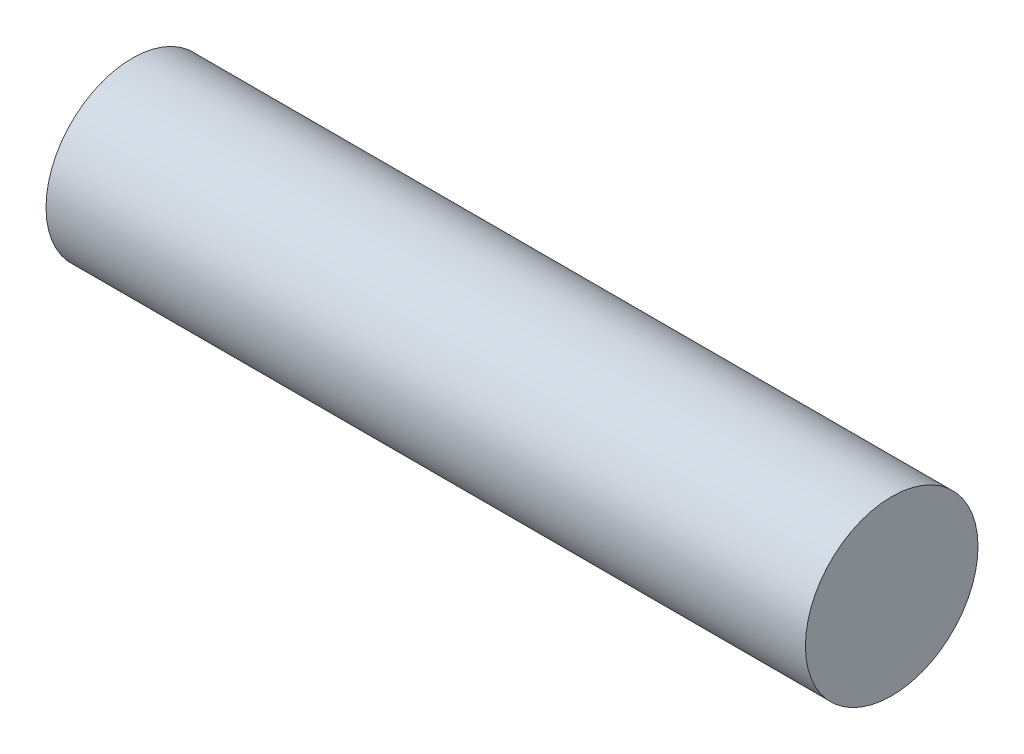
ISO-10303-21;
HEADER;
FILE_DESCRIPTION(('STEP AP214'),'2;1');
FILE_NAME('part.step','',(''),(''),'','','');
FILE_SCHEMA(('AUTOMOTIVE_DESIGN { 1 0 10303 214 1 1 1 1 }'));
ENDSEC;
DATA;
#1=APPLICATION_CONTEXT('core data for automotive mechanical design processes');
#2=APPLICATION_PROTOCOL_DEFINITION('international standard','automotive_design',2000,#1);
#3=PRODUCT_CONTEXT('',#1,'mechanical');
#4=PRODUCT('Part','Part','',(#3));
#5=PRODUCT_RELATED_PRODUCT_CATEGORY('part','',(#4));
#6=PRODUCT_DEFINITION_FORMATION('','',#4);
#7=PRODUCT_DEFINITION_CONTEXT('part definition',#1,'design');
#8=PRODUCT_DEFINITION('design','',#6,#7);
#9=PRODUCT_DEFINITION_SHAPE('','',#8);
#10=(LENGTH_UNIT() NAMED_UNIT(*) SI_UNIT(.MILLI.,.METRE.));
#11=(NAMED_UNIT(*) PLANE_ANGLE_UNIT() SI_UNIT($,.RADIAN.));
#12=(NAMED_UNIT(*) SI_UNIT($,.STERADIAN.) SOLID_ANGLE_UNIT());
#13=UNCERTAINTY_MEASURE_WITH_UNIT(LENGTH_MEASURE(1.E-05),#10,'distance_accuracy_value','');
#14=(GEOMETRIC_REPRESENTATION_CONTEXT(3) GLOBAL_UNCERTAINTY_ASSIGNED_CONTEXT((#13)) GLOBAL_UNIT_ASSIGNED_CONTEXT((#10,
#11,#12)) REPRESENTATION_CONTEXT('',''));
#15=CARTESIAN_POINT('',(0.,0.,0.));
#16=DIRECTION('',(0.,0.,1.));
#17=DIRECTION('',(1.,0.,0.));
#18=AXIS2_PLACEMENT_3D('',#15,#16,#17);
#19=CARTESIAN_POINT('',(1.7,5.99023791562577,0.75));
#20=DIRECTION('',(-1.,0.,0.));
#21=DIRECTION('',(0.,1.,0.));
#22=AXIS2_PLACEMENT_3D('',#19,#20,#21);
#23=PLANE('',#22);
#24=CARTESIAN_POINT('',(1.7,6.75,0.));
#25=DIRECTION('',(-1.,0.,0.));
#26=DIRECTION('',(0.,0.,-1.));
#27=AXIS2_PLACEMENT_3D('',#24,#25,#26);
#28=CIRCLE('',#27,0.75);
#29=CARTESIAN_POINT('',(1.7,6.75,-0.75));
#30=VERTEX_POINT('',#29);
#31=EDGE_CURVE('E22',#30,#30,#28,.F.);
#32=ORIENTED_EDGE('',*,*,#31,.F.);
#33=EDGE_LOOP('',(#32));
#34=FACE_BOUND('',#33,.T.);
#35=ADVANCED_FACE('F15',(#34),#23,.T.);
#36=CARTESIAN_POINT('',(8.3,5.99023797160392,-0.75));
#37=DIRECTION('',(1.,0.,0.));
#38=DIRECTION('',(0.,1.,0.));
#39=AXIS2_PLACEMENT_3D('',#36,#37,#38);
#40=PLANE('',#39);
#41=CARTESIAN_POINT('',(8.3,6.75,0.));
#42=DIRECTION('',(1.,0.,0.));
#43=DIRECTION('',(0.,-1.41721876900647E-07,0.99999999999999));
#44=AXIS2_PLACEMENT_3D('',#41,#42,#43);
#45=CIRCLE('',#44,0.75);
#46=CARTESIAN_POINT('',(8.3,6.74999989370859,0.749999999999993));
#47=VERTEX_POINT('',#46);
#48=EDGE_CURVE('E10',#47,#47,#45,.T.);
#49=ORIENTED_EDGE('',*,*,#48,.T.);
#50=EDGE_LOOP('',(#49));
#51=FACE_BOUND('',#50,.T.);
#52=ADVANCED_FACE('F30',(#51),#40,.T.);
#53=CARTESIAN_POINT('',(8.3,6.75,0.));
#54=DIRECTION('',(1.,0.,0.));
#55=DIRECTION('',(0.,0.,1.));
#56=AXIS2_PLACEMENT_3D('',#53,#54,#55);
#57=CYLINDRICAL_SURFACE('',#56,0.75);
#58=ORIENTED_EDGE('',*,*,#48,.F.);
#59=EDGE_LOOP('',(#58));
#60=FACE_BOUND('',#59,.T.);
#61=ORIENTED_EDGE('',*,*,#31,.T.);
#62=EDGE_LOOP('',(#61));
#63=FACE_BOUND('',#62,.T.);
#64=ADVANCED_FACE('F17',(#60,#63),#57,.T.);
#65=CLOSED_SHELL('',(#35,#52,#64));
#66=MANIFOLD_SOLID_BREP('B1',#65);
#67=ADVANCED_BREP_SHAPE_REPRESENTATION('',(#18,#66),#14);
#68=SHAPE_DEFINITION_REPRESENTATION(#9,#67);
ENDSEC;
END-ISO-10303-21;
